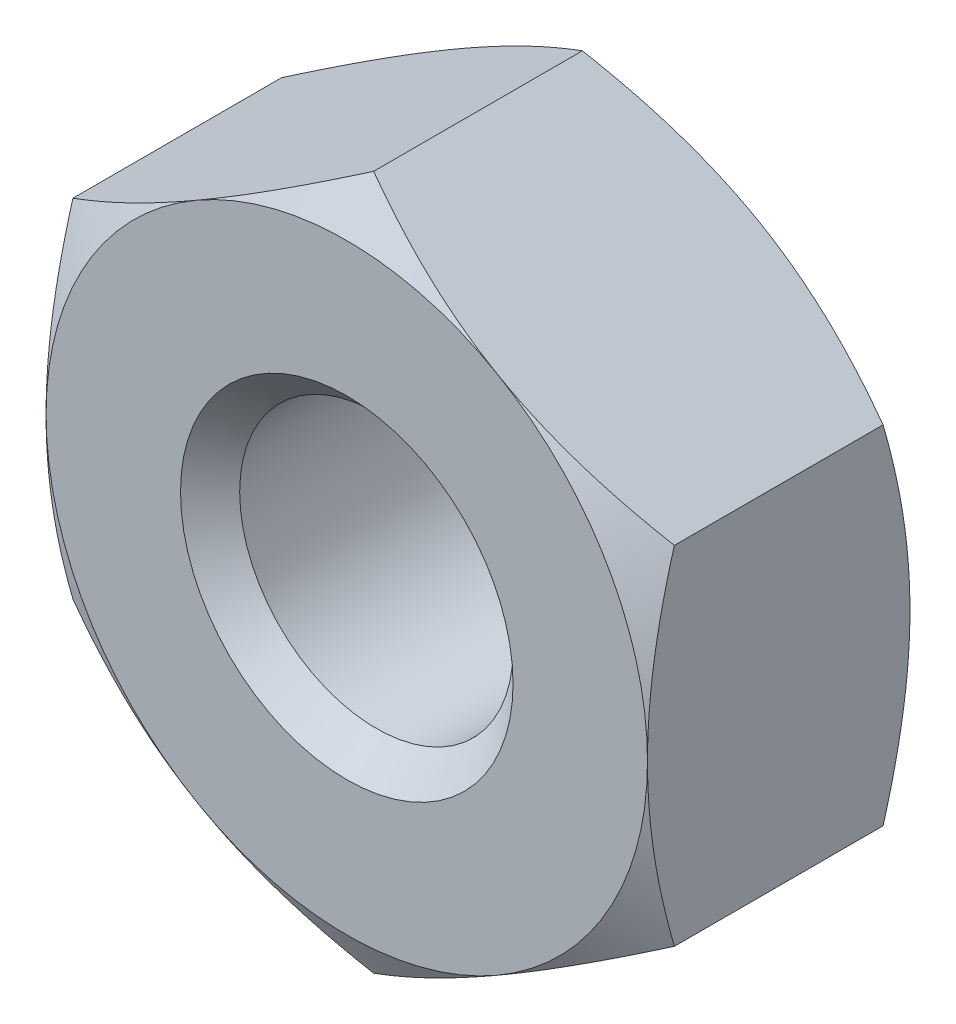
ISO-10303-21;
HEADER;
FILE_DESCRIPTION(('STEP AP214'),'2;1');
FILE_NAME('part.step','',(''),(''),'','','');
FILE_SCHEMA(('AUTOMOTIVE_DESIGN { 1 0 10303 214 1 1 1 1 }'));
ENDSEC;
DATA;
#1=APPLICATION_CONTEXT('core data for automotive mechanical design processes');
#2=APPLICATION_PROTOCOL_DEFINITION('international standard','automotive_design',2000,#1);
#3=PRODUCT_CONTEXT('',#1,'mechanical');
#4=PRODUCT('Part','Part','',(#3));
#5=PRODUCT_RELATED_PRODUCT_CATEGORY('part','',(#4));
#6=PRODUCT_DEFINITION_FORMATION('','',#4);
#7=PRODUCT_DEFINITION_CONTEXT('part definition',#1,'design');
#8=PRODUCT_DEFINITION('design','',#6,#7);
#9=PRODUCT_DEFINITION_SHAPE('','',#8);
#10=(LENGTH_UNIT() NAMED_UNIT(*) SI_UNIT(.MILLI.,.METRE.));
#11=(NAMED_UNIT(*) PLANE_ANGLE_UNIT() SI_UNIT($,.RADIAN.));
#12=(NAMED_UNIT(*) SI_UNIT($,.STERADIAN.) SOLID_ANGLE_UNIT());
#13=UNCERTAINTY_MEASURE_WITH_UNIT(LENGTH_MEASURE(1.E-05),#10,'distance_accuracy_value','');
#14=(GEOMETRIC_REPRESENTATION_CONTEXT(3) GLOBAL_UNCERTAINTY_ASSIGNED_CONTEXT((#13)) GLOBAL_UNIT_ASSIGNED_CONTEXT((#10,
#11,#12)) REPRESENTATION_CONTEXT('',''));
#15=CARTESIAN_POINT('',(0.,0.,0.));
#16=DIRECTION('',(0.,0.,1.));
#17=DIRECTION('',(1.,0.,0.));
#18=AXIS2_PLACEMENT_3D('',#15,#16,#17);
#19=CARTESIAN_POINT('',(0.,3.17542648054294,1.2));
#20=DIRECTION('',(0.5,-0.866025403784439,0.));
#21=DIRECTION('',(0.866025403784439,0.5,0.));
#22=AXIS2_PLACEMENT_3D('',#19,#20,#21);
#23=PLANE('',#22);
#24=CARTESIAN_POINT('',(0.000200000000000067,3.17554195059678,0.954313236635245));
#25=CARTESIAN_POINT('',(-0.120649220659906,3.10576962051743,0.994612337750741));
#26=CARTESIAN_POINT('',(-0.242541602622633,3.03539502097908,1.03126309740234));
#27=CARTESIAN_POINT('',(-0.488437126727892,2.89342717394439,1.0952378170302));
#28=CARTESIAN_POINT('',(-0.612444638573855,2.82183140359858,1.12253914432551));
#29=CARTESIAN_POINT('',(-0.858922797975943,2.67952717191842,1.16503825470589));
#30=CARTESIAN_POINT('',(-0.981355518587416,2.60884060771577,1.18051888137754));
#31=CARTESIAN_POINT('',(-1.22679714236891,2.46713482015519,1.19900060263006));
#32=CARTESIAN_POINT('',(-1.34980515323291,2.39611611197038,1.2020170005374));
#33=CARTESIAN_POINT('',(-1.57965878661079,2.26341005486544,1.19574685457145));
#34=CARTESIAN_POINT('',(-1.68653879125402,2.20170285541369,1.1879998457233));
#35=CARTESIAN_POINT('',(-1.89960246733475,2.07869048467395,1.16344481893565));
#36=CARTESIAN_POINT('',(-2.00578540164889,2.01738573896433,1.14662841034943));
#37=CARTESIAN_POINT('',(-2.21928848939318,1.89411967378235,1.10458807765405));
#38=CARTESIAN_POINT('',(-2.32658161614286,1.83217395817123,1.07918591931277));
#39=CARTESIAN_POINT('',(-2.53956747928405,1.70920651275308,1.02153277416002));
#40=CARTESIAN_POINT('',(-2.64526294502665,1.64818320715446,0.98929533670102));
#41=CARTESIAN_POINT('',(-2.7502,1.58759777021763,0.954313236635243));
#42=B_SPLINE_CURVE_WITH_KNOTS('',3,(#24,#25,#26,#27,#28,#29,#30,#31,#32,#33,#34,#35,#36,#37,#38,
#39,#40,#41),.UNSPECIFIED.,.F.,.F.,(4,2,2,2,2,2,2,2,4),(0.,0.435912828725888,0.872873557116331,
1.29901931904671,1.72464171213573,2.09526089052937,2.46622354066374,2.84541551798557,
3.22386274754524),.UNSPECIFIED.);
#43=CARTESIAN_POINT('',(0.,3.17542648054294,0.954379906938143));
#44=VERTEX_POINT('',#43);
#45=CARTESIAN_POINT('',(-1.375,2.38156986040721,1.2));
#46=VERTEX_POINT('',#45);
#47=EDGE_CURVE('E120',#44,#46,#42,.T.);
#48=ORIENTED_EDGE('',*,*,#47,.F.);
#49=DIRECTION('',(0.,0.,-1.));
#50=VECTOR('',#49,1.);
#51=CARTESIAN_POINT('',(0.,3.17542648054294,1.2));
#52=LINE('',#51,#50);
#53=CARTESIAN_POINT('',(0.,3.17542648054294,-0.954379906938143));
#54=VERTEX_POINT('',#53);
#55=EDGE_CURVE('E234',#44,#54,#52,.T.);
#56=ORIENTED_EDGE('',*,*,#55,.T.);
#57=CARTESIAN_POINT('',(-2.7502,1.58759777021763,-0.954313236635243));
#58=CARTESIAN_POINT('',(-2.6293507793401,1.65737010029699,-0.99461233775074));
#59=CARTESIAN_POINT('',(-2.50745839737737,1.72774469983533,-1.03126309740234));
#60=CARTESIAN_POINT('',(-2.26156287327211,1.86971254687003,-1.0952378170302));
#61=CARTESIAN_POINT('',(-2.13755536142615,1.94130831721583,-1.1225391443255));
#62=CARTESIAN_POINT('',(-1.89107720202406,2.08361254889599,-1.16503825470588));
#63=CARTESIAN_POINT('',(-1.76864448141259,2.15429911309864,-1.18051888137754));
#64=CARTESIAN_POINT('',(-1.52320285763109,2.29600490065923,-1.19900060263006));
#65=CARTESIAN_POINT('',(-1.40019484676709,2.36702360884404,-1.2020170005374));
#66=CARTESIAN_POINT('',(-1.17034121338921,2.49972966594897,-1.19574685457146));
#67=CARTESIAN_POINT('',(-1.06346120874598,2.56143686540072,-1.1879998457233));
#68=CARTESIAN_POINT('',(-0.850397532665252,2.68444923614046,-1.16344481893565));
#69=CARTESIAN_POINT('',(-0.744214598351113,2.74575398185008,-1.14662841034943));
#70=CARTESIAN_POINT('',(-0.530711510606817,2.86902004703206,-1.10458807765405));
#71=CARTESIAN_POINT('',(-0.423418383857146,2.93096576264318,-1.07918591931277));
#72=CARTESIAN_POINT('',(-0.210432520715949,3.05393320806134,-1.02153277416002));
#73=CARTESIAN_POINT('',(-0.104737054973348,3.11495651365995,-0.989295336701022));
#74=CARTESIAN_POINT('',(0.000199999999999903,3.17554195059678,-0.954313236635244));
#75=B_SPLINE_CURVE_WITH_KNOTS('',3,(#57,#58,#59,#60,#61,#62,#63,#64,#65,#66,#67,#68,#69,#70,#71,
#72,#73,#74),.UNSPECIFIED.,.F.,.F.,(4,2,2,2,2,2,2,2,4),(0.,0.435912828725888,0.872873557116332,
1.29901931904671,1.72464171213573,2.09526089052937,2.46622354066374,2.84541551798557,
3.22386274754524),.UNSPECIFIED.);
#76=CARTESIAN_POINT('',(-1.375,2.38156986040721,-1.2));
#77=VERTEX_POINT('',#76);
#78=EDGE_CURVE('E273',#77,#54,#75,.T.);
#79=ORIENTED_EDGE('',*,*,#78,.F.);
#80=CARTESIAN_POINT('',(-2.75,1.58771324027147,-0.954379906938141));
#81=VERTEX_POINT('',#80);
#82=EDGE_CURVE('E280',#81,#77,#75,.T.);
#83=ORIENTED_EDGE('',*,*,#82,.F.);
#84=DIRECTION('',(0.,0.,-1.));
#85=VECTOR('',#84,1.);
#86=CARTESIAN_POINT('',(-2.75,1.58771324027147,1.2));
#87=LINE('',#86,#85);
#88=CARTESIAN_POINT('',(-2.75,1.58771324027147,0.954379906938141));
#89=VERTEX_POINT('',#88);
#90=EDGE_CURVE('E148',#89,#81,#87,.T.);
#91=ORIENTED_EDGE('',*,*,#90,.F.);
#92=EDGE_CURVE('E130',#46,#89,#42,.T.);
#93=ORIENTED_EDGE('',*,*,#92,.F.);
#94=EDGE_LOOP('',(#48,#56,#79,#83,#91,#93));
#95=FACE_BOUND('',#94,.T.);
#96=ADVANCED_FACE('F32',(#95),#23,.F.);
#97=CARTESIAN_POINT('',(-2.75,1.58771324027147,1.2));
#98=DIRECTION('',(1.,0.,0.));
#99=DIRECTION('',(0.,0.,-1.));
#100=AXIS2_PLACEMENT_3D('',#97,#98,#99);
#101=PLANE('',#100);
#102=CARTESIAN_POINT('',(-2.75,-4.30390301720192,-0.161076408690709));
#103=CARTESIAN_POINT('',(-2.75,-4.18346183634496,-0.102495462412532));
#104=CARTESIAN_POINT('',(-2.75,-4.0627483469381,-0.0444649946513373));
#105=CARTESIAN_POINT('',(-2.75,-3.82063209362853,0.0701861633604315));
#106=CARTESIAN_POINT('',(-2.75,-3.69922922817248,0.126806638918857));
#107=CARTESIAN_POINT('',(-2.75,-3.45498258352431,0.238605553593725));
#108=CARTESIAN_POINT('',(-2.75,-3.33213458050091,0.293774796098297));
#109=CARTESIAN_POINT('',(-2.75,-3.08547511508691,0.401907353546585));
#110=CARTESIAN_POINT('',(-2.75,-2.9616636973982,0.454870770123538));
#111=CARTESIAN_POINT('',(-2.75,-2.70873002170802,0.559731360532049));
#112=CARTESIAN_POINT('',(-2.75,-2.57956837503753,0.611534033727881));
#113=CARTESIAN_POINT('',(-2.75,-2.31974843728962,0.711312632694245));
#114=CARTESIAN_POINT('',(-2.75,-2.18908998221528,0.759288134467373));
#115=CARTESIAN_POINT('',(-2.75,-1.92630078982448,0.850181497874872));
#116=CARTESIAN_POINT('',(-2.75,-1.79417351465773,0.893109270571312));
#117=CARTESIAN_POINT('',(-2.75,-1.52802381114163,0.972555534531259));
#118=CARTESIAN_POINT('',(-2.75,-1.39400198148718,1.00907600370378));
#119=CARTESIAN_POINT('',(-2.75,-1.1247426051988,1.07378343729295));
#120=CARTESIAN_POINT('',(-2.75,-0.98951651847669,1.10201722216622));
#121=CARTESIAN_POINT('',(-2.75,-0.717342133540144,1.14858513052455));
#122=CARTESIAN_POINT('',(-2.75,-0.580394010714915,1.16692025396294));
#123=CARTESIAN_POINT('',(-2.75,-0.307264223292112,1.19198982834036));
#124=CARTESIAN_POINT('',(-2.75,-0.171096876658298,1.19887642876326));
#125=CARTESIAN_POINT('',(-2.75,0.101336625313081,1.20086815686916));
#126=CARTESIAN_POINT('',(-2.75,0.237602781705956,1.19597315681277));
#127=CARTESIAN_POINT('',(-2.75,0.467797680560964,1.17810232782276));
#128=CARTESIAN_POINT('',(-2.75,0.561967915481139,1.1680452223586));
#129=CARTESIAN_POINT('',(-2.75,0.749642226834777,1.14290982744911));
#130=CARTESIAN_POINT('',(-2.75,0.843146215373774,1.12783088758256));
#131=CARTESIAN_POINT('',(-2.75,1.12250913895018,1.07584910895217));
#132=CARTESIAN_POINT('',(-2.75,1.30711940645803,1.03221009052051));
#133=CARTESIAN_POINT('',(-2.75,1.67667658210268,0.930598702582513));
#134=CARTESIAN_POINT('',(-2.75,1.86153763251216,0.87232596653366));
#135=CARTESIAN_POINT('',(-2.75,2.1362551669383,0.777677043706087));
#136=CARTESIAN_POINT('',(-2.75,2.2273905801987,0.74492404175435));
#137=CARTESIAN_POINT('',(-2.75,2.40890358977874,0.677382180856329));
#138=CARTESIAN_POINT('',(-2.75,2.49928119650105,0.642593349909013));
#139=CARTESIAN_POINT('',(-2.75,2.71825345258565,0.555929422896168));
#140=CARTESIAN_POINT('',(-2.75,2.84649489461499,0.503164300130228));
#141=CARTESIAN_POINT('',(-2.75,3.1018305499463,0.394920499569286));
#142=CARTESIAN_POINT('',(-2.75,3.22892468521528,0.33944163882475));
#143=CARTESIAN_POINT('',(-2.75,3.60884508520057,0.16980731720821));
#144=CARTESIAN_POINT('',(-2.75,3.86025161382976,0.0524776136911526));
#145=CARTESIAN_POINT('',(-2.75,4.36073216273561,-0.187701259786246));
#146=CARTESIAN_POINT('',(-2.75,4.60980322815241,-0.310556513491473));
#147=CARTESIAN_POINT('',(-2.75,5.10611636333848,-0.559922515280733));
#148=CARTESIAN_POINT('',(-2.75,5.35335836018192,-0.686433408140724));
#149=CARTESIAN_POINT('',(-2.75,5.82470677893949,-0.930706625425102));
#150=CARTESIAN_POINT('',(-2.75,6.04892545541808,-1.04825313857293));
#151=CARTESIAN_POINT('',(-2.75,6.49653363605935,-1.28493475206167));
#152=CARTESIAN_POINT('',(-2.75,6.71992310596418,-1.40406991712259));
#153=CARTESIAN_POINT('',(-2.75,7.1654482395454,-1.64321658337444));
#154=CARTESIAN_POINT('',(-2.75,7.38758566096615,-1.76322481484964));
#155=CARTESIAN_POINT('',(-2.75,7.83133346602344,-2.00418017005894));
#156=CARTESIAN_POINT('',(-2.75,8.05294388084433,-2.12512723633796));
#157=CARTESIAN_POINT('',(-2.75,8.27436218409939,-2.24642255294576));
#158=B_SPLINE_CURVE_WITH_KNOTS('',3,(#102,#103,#104,#105,#106,#107,#108,#109,#110,#111,#112,
#113,#114,#115,#116,#117,#118,#119,#120,#121,#122,#123,#124,#125,#126,#127,#128,#129,#130,#131,
#132,#133,#134,#135,#136,#137,#138,#139,#140,#141,#142,#143,#144,#145,#146,#147,#148,#149,#150,
#151,#152,#153,#154,#155,#156,#157),.UNSPECIFIED.,.F.,.F.,(4,2,2,2,2,2,2,2,2,2,2,2,2,2,2,2,2,2,
2,2,2,2,2,2,2,2,2,4),(0.,0.401800999438933,0.803662809496789,1.2076472715733,1.61161309946231,
2.02905420356356,2.44654149029695,2.86319485917833,3.27971938165075,3.69384308413964,
4.10792494441558,4.51645837884831,4.92499624273394,5.20897756068255,5.49299567382162,
6.06133052851013,6.64245100592872,6.93295892589162,7.22346285140748,7.63943779361214,
8.055440817965,8.88763374209439,9.72076650036463,10.5539322989188,11.31341213061,
12.0729229978166,12.8303656683841,13.5877623445881),.UNSPECIFIED.);
#159=CARTESIAN_POINT('',(-2.75,0.,1.2));
#160=VERTEX_POINT('',#159);
#161=EDGE_CURVE('E137',#89,#160,#158,.F.);
#162=ORIENTED_EDGE('',*,*,#161,.F.);
#163=ORIENTED_EDGE('',*,*,#90,.T.);
#164=CARTESIAN_POINT('',(-2.75,-4.30390301720192,0.161076408690709));
#165=CARTESIAN_POINT('',(-2.75,-4.18346183634496,0.102495462412532));
#166=CARTESIAN_POINT('',(-2.75,-4.0627483469381,0.0444649946513373));
#167=CARTESIAN_POINT('',(-2.75,-3.82063209362853,-0.0701861633604315));
#168=CARTESIAN_POINT('',(-2.75,-3.69922922817248,-0.126806638918857));
#169=CARTESIAN_POINT('',(-2.75,-3.45498258352431,-0.238605553593725));
#170=CARTESIAN_POINT('',(-2.75,-3.33213458050091,-0.293774796098297));
#171=CARTESIAN_POINT('',(-2.75,-3.08547511508691,-0.401907353546585));
#172=CARTESIAN_POINT('',(-2.75,-2.9616636973982,-0.454870770123538));
#173=CARTESIAN_POINT('',(-2.75,-2.70873002170802,-0.559731360532049));
#174=CARTESIAN_POINT('',(-2.75,-2.57956837503753,-0.611534033727881));
#175=CARTESIAN_POINT('',(-2.75,-2.31974843728962,-0.711312632694245));
#176=CARTESIAN_POINT('',(-2.75,-2.18908998221528,-0.759288134467373));
#177=CARTESIAN_POINT('',(-2.75,-1.92630078982448,-0.850181497874872));
#178=CARTESIAN_POINT('',(-2.75,-1.79417351465773,-0.893109270571312));
#179=CARTESIAN_POINT('',(-2.75,-1.52802381114163,-0.972555534531259));
#180=CARTESIAN_POINT('',(-2.75,-1.39400198148718,-1.00907600370378));
#181=CARTESIAN_POINT('',(-2.75,-1.1247426051988,-1.07378343729295));
#182=CARTESIAN_POINT('',(-2.75,-0.98951651847669,-1.10201722216622));
#183=CARTESIAN_POINT('',(-2.75,-0.717342133540144,-1.14858513052455));
#184=CARTESIAN_POINT('',(-2.75,-0.580394010714915,-1.16692025396294));
#185=CARTESIAN_POINT('',(-2.75,-0.307264223292112,-1.19198982834036));
#186=CARTESIAN_POINT('',(-2.75,-0.171096876658298,-1.19887642876326));
#187=CARTESIAN_POINT('',(-2.75,0.101336625313081,-1.20086815686916));
#188=CARTESIAN_POINT('',(-2.75,0.237602781705956,-1.19597315681277));
#189=CARTESIAN_POINT('',(-2.75,0.467797680560964,-1.17810232782276));
#190=CARTESIAN_POINT('',(-2.75,0.561967915481139,-1.1680452223586));
#191=CARTESIAN_POINT('',(-2.75,0.749642226834777,-1.14290982744911));
#192=CARTESIAN_POINT('',(-2.75,0.843146215373774,-1.12783088758256));
#193=CARTESIAN_POINT('',(-2.75,1.12250913895018,-1.07584910895217));
#194=CARTESIAN_POINT('',(-2.75,1.30711940645803,-1.03221009052051));
#195=CARTESIAN_POINT('',(-2.75,1.67667658210268,-0.930598702582513));
#196=CARTESIAN_POINT('',(-2.75,1.86153763251216,-0.87232596653366));
#197=CARTESIAN_POINT('',(-2.75,2.1362551669383,-0.777677043706087));
#198=CARTESIAN_POINT('',(-2.75,2.2273905801987,-0.74492404175435));
#199=CARTESIAN_POINT('',(-2.75,2.40890358977874,-0.677382180856329));
#200=CARTESIAN_POINT('',(-2.75,2.49928119650105,-0.642593349909013));
#201=CARTESIAN_POINT('',(-2.75,2.71825345258565,-0.555929422896168));
#202=CARTESIAN_POINT('',(-2.75,2.84649489461499,-0.503164300130228));
#203=CARTESIAN_POINT('',(-2.75,3.1018305499463,-0.394920499569286));
#204=CARTESIAN_POINT('',(-2.75,3.22892468521528,-0.33944163882475));
#205=CARTESIAN_POINT('',(-2.75,3.60884508520057,-0.16980731720821));
#206=CARTESIAN_POINT('',(-2.75,3.86025161382976,-0.0524776136911526));
#207=CARTESIAN_POINT('',(-2.75,4.36073216273561,0.187701259786246));
#208=CARTESIAN_POINT('',(-2.75,4.60980322815241,0.310556513491473));
#209=CARTESIAN_POINT('',(-2.75,5.10611636333848,0.559922515280733));
#210=CARTESIAN_POINT('',(-2.75,5.35335836018192,0.686433408140724));
#211=CARTESIAN_POINT('',(-2.75,5.82470677893949,0.930706625425102));
#212=CARTESIAN_POINT('',(-2.75,6.04892545541808,1.04825313857293));
#213=CARTESIAN_POINT('',(-2.75,6.49653363605935,1.28493475206167));
#214=CARTESIAN_POINT('',(-2.75,6.71992310596418,1.40406991712259));
#215=CARTESIAN_POINT('',(-2.75,7.1654482395454,1.64321658337444));
#216=CARTESIAN_POINT('',(-2.75,7.38758566096615,1.76322481484964));
#217=CARTESIAN_POINT('',(-2.75,7.83133346602344,2.00418017005894));
#218=CARTESIAN_POINT('',(-2.75,8.05294388084433,2.12512723633796));
#219=CARTESIAN_POINT('',(-2.75,8.27436218409939,2.24642255294576));
#220=B_SPLINE_CURVE_WITH_KNOTS('',3,(#164,#165,#166,#167,#168,#169,#170,#171,#172,#173,#174,
#175,#176,#177,#178,#179,#180,#181,#182,#183,#184,#185,#186,#187,#188,#189,#190,#191,#192,#193,
#194,#195,#196,#197,#198,#199,#200,#201,#202,#203,#204,#205,#206,#207,#208,#209,#210,#211,#212,
#213,#214,#215,#216,#217,#218,#219),.UNSPECIFIED.,.F.,.F.,(4,2,2,2,2,2,2,2,2,2,2,2,2,2,2,2,2,2,
2,2,2,2,2,2,2,2,2,4),(0.,0.401800999438933,0.803662809496789,1.2076472715733,1.61161309946231,
2.02905420356356,2.44654149029695,2.86319485917833,3.27971938165075,3.69384308413964,
4.10792494441558,4.51645837884831,4.92499624273394,5.20897756068255,5.49299567382162,
6.06133052851013,6.64245100592872,6.93295892589162,7.22346285140748,7.63943779361214,
8.055440817965,8.88763374209439,9.72076650036463,10.5539322989188,11.31341213061,
12.0729229978166,12.8303656683841,13.5877623445881),.UNSPECIFIED.);
#221=CARTESIAN_POINT('',(-2.75,0.,-1.2));
#222=VERTEX_POINT('',#221);
#223=EDGE_CURVE('E228',#222,#81,#220,.T.);
#224=ORIENTED_EDGE('',*,*,#223,.F.);
#225=CARTESIAN_POINT('',(-2.75,-1.58771324027169,-0.954379906938282));
#226=VERTEX_POINT('',#225);
#227=EDGE_CURVE('E292',#226,#222,#220,.T.);
#228=ORIENTED_EDGE('',*,*,#227,.F.);
#229=DIRECTION('',(0.,0.,-1.));
#230=VECTOR('',#229,1.);
#231=CARTESIAN_POINT('',(-2.75,-1.58771324027147,1.2));
#232=LINE('',#231,#230);
#233=CARTESIAN_POINT('',(-2.75,-1.58771324027147,0.95437990693814));
#234=VERTEX_POINT('',#233);
#235=EDGE_CURVE('E242',#234,#226,#232,.T.);
#236=ORIENTED_EDGE('',*,*,#235,.F.);
#237=EDGE_CURVE('E149',#160,#234,#158,.F.);
#238=ORIENTED_EDGE('',*,*,#237,.F.);
#239=EDGE_LOOP('',(#162,#163,#224,#228,#236,#238));
#240=FACE_BOUND('',#239,.T.);
#241=ADVANCED_FACE('F212',(#240),#101,.F.);
#242=CARTESIAN_POINT('',(-2.75,-1.58771324027147,1.2));
#243=DIRECTION('',(0.5,0.866025403784438,0.));
#244=DIRECTION('',(-0.866025403784439,0.5,0.));
#245=AXIS2_PLACEMENT_3D('',#242,#243,#244);
#246=PLANE('',#245);
#247=CARTESIAN_POINT('',(-2.7502,-1.58759777021764,0.954313236635242));
#248=CARTESIAN_POINT('',(-2.6293507793401,-1.65737010029699,0.994612337750739));
#249=CARTESIAN_POINT('',(-2.50745839737737,-1.72774469983533,1.03126309740234));
#250=CARTESIAN_POINT('',(-2.26156287327211,-1.86971254687003,1.0952378170302));
#251=CARTESIAN_POINT('',(-2.13755536142615,-1.94130831721583,1.1225391443255));
#252=CARTESIAN_POINT('',(-1.89107720202406,-2.08361254889599,1.16503825470588));
#253=CARTESIAN_POINT('',(-1.76864448141259,-2.15429911309864,1.18051888137754));
#254=CARTESIAN_POINT('',(-1.52320285763109,-2.29600490065923,1.19900060263006));
#255=CARTESIAN_POINT('',(-1.40019484676709,-2.36702360884404,1.2020170005374));
#256=CARTESIAN_POINT('',(-1.17034121338921,-2.49972966594897,1.19574685457145));
#257=CARTESIAN_POINT('',(-1.06346120874598,-2.56143686540073,1.1879998457233));
#258=CARTESIAN_POINT('',(-0.850397532665252,-2.68444923614047,1.16344481893564));
#259=CARTESIAN_POINT('',(-0.744214598351113,-2.74575398185008,1.14662841034943));
#260=CARTESIAN_POINT('',(-0.530711510606818,-2.86902004703207,1.10458807765404));
#261=CARTESIAN_POINT('',(-0.423418383857146,-2.93096576264319,1.07918591931277));
#262=CARTESIAN_POINT('',(-0.21043252071595,-3.05393320806134,1.02153277416002));
#263=CARTESIAN_POINT('',(-0.104737054973348,-3.11495651365996,0.989295336701018));
#264=CARTESIAN_POINT('',(0.000199999999999743,-3.17554195059679,0.954313236635241));
#265=B_SPLINE_CURVE_WITH_KNOTS('',3,(#247,#248,#249,#250,#251,#252,#253,#254,#255,#256,#257,
#258,#259,#260,#261,#262,#263,#264),.UNSPECIFIED.,.F.,.F.,(4,2,2,2,2,2,2,2,4),(0.,
0.435912828725888,0.872873557116332,1.29901931904672,1.72464171213574,2.09526089052938,
2.46622354066374,2.84541551798557,3.22386274754525),.UNSPECIFIED.);
#266=CARTESIAN_POINT('',(-1.375,-2.38156986040721,1.2));
#267=VERTEX_POINT('',#266);
#268=EDGE_CURVE('E206',#234,#267,#265,.T.);
#269=ORIENTED_EDGE('',*,*,#268,.F.);
#270=ORIENTED_EDGE('',*,*,#235,.T.);
#271=CARTESIAN_POINT('',(0.000199999999999867,-3.17554195059679,-0.954313236635241));
#272=CARTESIAN_POINT('',(-0.120649220659906,-3.10576962051743,-0.994612337750738));
#273=CARTESIAN_POINT('',(-0.242541602622634,-3.03539502097909,-1.03126309740234));
#274=CARTESIAN_POINT('',(-0.488437126727893,-2.89342717394439,-1.0952378170302));
#275=CARTESIAN_POINT('',(-0.612444638573856,-2.82183140359859,-1.1225391443255));
#276=CARTESIAN_POINT('',(-0.858922797975945,-2.67952717191843,-1.16503825470588));
#277=CARTESIAN_POINT('',(-0.981355518587418,-2.60884060771578,-1.18051888137754));
#278=CARTESIAN_POINT('',(-1.22679714236892,-2.46713482015519,-1.19900060263006));
#279=CARTESIAN_POINT('',(-1.34980515323291,-2.39611611197038,-1.2020170005374));
#280=CARTESIAN_POINT('',(-1.57965878661079,-2.26341005486545,-1.19574685457145));
#281=CARTESIAN_POINT('',(-1.68653879125402,-2.20170285541369,-1.1879998457233));
#282=CARTESIAN_POINT('',(-1.89960246733475,-2.07869048467395,-1.16344481893564));
#283=CARTESIAN_POINT('',(-2.00578540164889,-2.01738573896434,-1.14662841034943));
#284=CARTESIAN_POINT('',(-2.21928848939319,-1.89411967378235,-1.10458807765404));
#285=CARTESIAN_POINT('',(-2.32658161614286,-1.83217395817123,-1.07918591931277));
#286=CARTESIAN_POINT('',(-2.53956747928405,-1.70920651275308,-1.02153277416002));
#287=CARTESIAN_POINT('',(-2.64526294502665,-1.64818320715446,-0.989295336701019));
#288=CARTESIAN_POINT('',(-2.7502,-1.58759777021764,-0.954313236635242));
#289=B_SPLINE_CURVE_WITH_KNOTS('',3,(#271,#272,#273,#274,#275,#276,#277,#278,#279,#280,#281,
#282,#283,#284,#285,#286,#287,#288),.UNSPECIFIED.,.F.,.F.,(4,2,2,2,2,2,2,2,4),(0.,
0.435912828725888,0.872873557116332,1.29901931904672,1.72464171213574,2.09526089052938,
2.46622354066374,2.84541551798557,3.22386274754525),.UNSPECIFIED.);
#290=CARTESIAN_POINT('',(-1.375,-2.38156986040721,-1.2));
#291=VERTEX_POINT('',#290);
#292=EDGE_CURVE('E218',#291,#226,#289,.T.);
#293=ORIENTED_EDGE('',*,*,#292,.F.);
#294=CARTESIAN_POINT('',(0.,-3.17542648054295,-0.954379906938139));
#295=VERTEX_POINT('',#294);
#296=EDGE_CURVE('E226',#295,#291,#289,.T.);
#297=ORIENTED_EDGE('',*,*,#296,.F.);
#298=DIRECTION('',(0.,0.,-1.));
#299=VECTOR('',#298,1.);
#300=CARTESIAN_POINT('',(0.,-3.17542648054295,1.2));
#301=LINE('',#300,#299);
#302=CARTESIAN_POINT('',(0.,-3.17542648054295,0.954379906938139));
#303=VERTEX_POINT('',#302);
#304=EDGE_CURVE('E240',#303,#295,#301,.T.);
#305=ORIENTED_EDGE('',*,*,#304,.F.);
#306=EDGE_CURVE('E200',#267,#303,#265,.T.);
#307=ORIENTED_EDGE('',*,*,#306,.F.);
#308=EDGE_LOOP('',(#269,#270,#293,#297,#305,#307));
#309=FACE_BOUND('',#308,.T.);
#310=ADVANCED_FACE('F208',(#309),#246,.F.);
#311=CARTESIAN_POINT('',(0.,-3.17542648054295,1.2));
#312=DIRECTION('',(-0.500000000000001,0.866025403784438,0.));
#313=DIRECTION('',(-0.866025403784438,-0.500000000000001,0.));
#314=AXIS2_PLACEMENT_3D('',#311,#312,#313);
#315=PLANE('',#314);
#316=CARTESIAN_POINT('',(-0.000200000000000038,-3.17554195059679,0.954313236635241));
#317=CARTESIAN_POINT('',(0.120649220659906,-3.10576962051743,0.994612337750738));
#318=CARTESIAN_POINT('',(0.242541602622634,-3.03539502097909,1.03126309740234));
#319=CARTESIAN_POINT('',(0.488437126727893,-2.89342717394439,1.0952378170302));
#320=CARTESIAN_POINT('',(0.612444638573855,-2.82183140359859,1.1225391443255));
#321=CARTESIAN_POINT('',(0.858922797975944,-2.67952717191843,1.16503825470588));
#322=CARTESIAN_POINT('',(0.981355518587417,-2.60884060771578,1.18051888137754));
#323=CARTESIAN_POINT('',(1.22679714236892,-2.46713482015519,1.19900060263006));
#324=CARTESIAN_POINT('',(1.34980515323291,-2.39611611197038,1.2020170005374));
#325=CARTESIAN_POINT('',(1.57965878661079,-2.26341005486545,1.19574685457145));
#326=CARTESIAN_POINT('',(1.68653879125402,-2.20170285541369,1.1879998457233));
#327=CARTESIAN_POINT('',(1.89960246733475,-2.07869048467395,1.16344481893565));
#328=CARTESIAN_POINT('',(2.00578540164889,-2.01738573896434,1.14662841034943));
#329=CARTESIAN_POINT('',(2.21928848939318,-1.89411967378235,1.10458807765405));
#330=CARTESIAN_POINT('',(2.32658161614285,-1.83217395817123,1.07918591931277));
#331=CARTESIAN_POINT('',(2.53956747928405,-1.70920651275308,1.02153277416002));
#332=CARTESIAN_POINT('',(2.64526294502665,-1.64818320715447,0.989295336701021));
#333=CARTESIAN_POINT('',(2.7502,-1.58759777021764,0.954313236635244));
#334=B_SPLINE_CURVE_WITH_KNOTS('',3,(#316,#317,#318,#319,#320,#321,#322,#323,#324,#325,#326,
#327,#328,#329,#330,#331,#332,#333),.UNSPECIFIED.,.F.,.F.,(4,2,2,2,2,2,2,2,4),(0.,
0.435912828725888,0.872873557116332,1.29901931904672,1.72464171213574,2.09526089052938,
2.46622354066374,2.84541551798557,3.22386274754524),.UNSPECIFIED.);
#335=CARTESIAN_POINT('',(1.375,-2.38156986040721,1.2));
#336=VERTEX_POINT('',#335);
#337=EDGE_CURVE('E207',#303,#336,#334,.T.);
#338=ORIENTED_EDGE('',*,*,#337,.F.);
#339=ORIENTED_EDGE('',*,*,#304,.T.);
#340=CARTESIAN_POINT('',(2.7502,-1.58759777021764,-0.954313236635244));
#341=CARTESIAN_POINT('',(2.62935077934009,-1.65737010029699,-0.994612337750741));
#342=CARTESIAN_POINT('',(2.50745839737737,-1.72774469983533,-1.03126309740234));
#343=CARTESIAN_POINT('',(2.26156287327211,-1.86971254687003,-1.0952378170302));
#344=CARTESIAN_POINT('',(2.13755536142614,-1.94130831721583,-1.1225391443255));
#345=CARTESIAN_POINT('',(1.89107720202406,-2.08361254889599,-1.16503825470588));
#346=CARTESIAN_POINT('',(1.76864448141258,-2.15429911309864,-1.18051888137754));
#347=CARTESIAN_POINT('',(1.52320285763108,-2.29600490065923,-1.19900060263006));
#348=CARTESIAN_POINT('',(1.40019484676709,-2.36702360884404,-1.2020170005374));
#349=CARTESIAN_POINT('',(1.17034121338921,-2.49972966594897,-1.19574685457145));
#350=CARTESIAN_POINT('',(1.06346120874598,-2.56143686540073,-1.1879998457233));
#351=CARTESIAN_POINT('',(0.85039753266525,-2.68444923614047,-1.16344481893564));
#352=CARTESIAN_POINT('',(0.744214598351111,-2.74575398185008,-1.14662841034943));
#353=CARTESIAN_POINT('',(0.530711510606816,-2.86902004703207,-1.10458807765404));
#354=CARTESIAN_POINT('',(0.423418383857145,-2.93096576264319,-1.07918591931277));
#355=CARTESIAN_POINT('',(0.210432520715949,-3.05393320806134,-1.02153277416002));
#356=CARTESIAN_POINT('',(0.104737054973347,-3.11495651365996,-0.989295336701018));
#357=CARTESIAN_POINT('',(-0.000200000000000245,-3.17554195059679,-0.95431323663524));
#358=B_SPLINE_CURVE_WITH_KNOTS('',3,(#340,#341,#342,#343,#344,#345,#346,#347,#348,#349,#350,
#351,#352,#353,#354,#355,#356,#357),.UNSPECIFIED.,.F.,.F.,(4,2,2,2,2,2,2,2,4),(0.,
0.435912828725888,0.872873557116331,1.29901931904671,1.72464171213573,2.09526089052937,
2.46622354066374,2.84541551798557,3.22386274754524),.UNSPECIFIED.);
#359=CARTESIAN_POINT('',(1.375,-2.38156986040721,-1.2));
#360=VERTEX_POINT('',#359);
#361=EDGE_CURVE('E227',#360,#295,#358,.T.);
#362=ORIENTED_EDGE('',*,*,#361,.F.);
#363=CARTESIAN_POINT('',(2.75,-1.58771324027169,-0.954379906938284));
#364=VERTEX_POINT('',#363);
#365=EDGE_CURVE('E281',#364,#360,#358,.T.);
#366=ORIENTED_EDGE('',*,*,#365,.F.);
#367=DIRECTION('',(0.,0.,-1.));
#368=VECTOR('',#367,1.);
#369=CARTESIAN_POINT('',(2.75,-1.58771324027147,1.2));
#370=LINE('',#369,#368);
#371=CARTESIAN_POINT('',(2.75,-1.58771324027169,0.954379906938284));
#372=VERTEX_POINT('',#371);
#373=EDGE_CURVE('E238',#372,#364,#370,.T.);
#374=ORIENTED_EDGE('',*,*,#373,.F.);
#375=EDGE_CURVE('E194',#336,#372,#334,.T.);
#376=ORIENTED_EDGE('',*,*,#375,.F.);
#377=EDGE_LOOP('',(#338,#339,#362,#366,#374,#376));
#378=FACE_BOUND('',#377,.T.);
#379=ADVANCED_FACE('F211',(#378),#315,.F.);
#380=CARTESIAN_POINT('',(2.75,1.58771324027147,1.2));
#381=DIRECTION('',(-1.,0.,0.));
#382=DIRECTION('',(0.,0.,1.));
#383=AXIS2_PLACEMENT_3D('',#380,#381,#382);
#384=PLANE('',#383);
#385=CARTESIAN_POINT('',(2.75,-4.30390301720192,-0.161076408690707));
#386=CARTESIAN_POINT('',(2.75,-4.18346183634496,-0.10249546241253));
#387=CARTESIAN_POINT('',(2.75,-4.0627483469381,-0.0444649946513354));
#388=CARTESIAN_POINT('',(2.75,-3.82063209362853,0.0701861633604329));
#389=CARTESIAN_POINT('',(2.75,-3.69922922817248,0.126806638918858));
#390=CARTESIAN_POINT('',(2.75,-3.45498258352431,0.238605553593726));
#391=CARTESIAN_POINT('',(2.75,-3.33213458050091,0.293774796098298));
#392=CARTESIAN_POINT('',(2.75,-3.08547511508691,0.401907353546586));
#393=CARTESIAN_POINT('',(2.75,-2.9616636973982,0.454870770123539));
#394=CARTESIAN_POINT('',(2.75,-2.70873002170802,0.559731360532051));
#395=CARTESIAN_POINT('',(2.75,-2.57956837503753,0.611534033727882));
#396=CARTESIAN_POINT('',(2.75,-2.31974843728962,0.711312632694246));
#397=CARTESIAN_POINT('',(2.75,-2.18908998221529,0.759288134467374));
#398=CARTESIAN_POINT('',(2.75,-1.92630078982448,0.850181497874874));
#399=CARTESIAN_POINT('',(2.75,-1.79417351465773,0.893109270571313));
#400=CARTESIAN_POINT('',(2.75,-1.52802381114164,0.97255553453126));
#401=CARTESIAN_POINT('',(2.75,-1.39400198148719,1.00907600370379));
#402=CARTESIAN_POINT('',(2.75,-1.1247426051988,1.07378343729295));
#403=CARTESIAN_POINT('',(2.75,-0.989516518476692,1.10201722216623));
#404=CARTESIAN_POINT('',(2.75,-0.717342133540146,1.14858513052455));
#405=CARTESIAN_POINT('',(2.75,-0.580394010714917,1.16692025396294));
#406=CARTESIAN_POINT('',(2.75,-0.307264223292114,1.19198982834036));
#407=CARTESIAN_POINT('',(2.75,-0.1710968766583,1.19887642876326));
#408=CARTESIAN_POINT('',(2.75,0.10133662531308,1.20086815686916));
#409=CARTESIAN_POINT('',(2.75,0.237602781705954,1.19597315681277));
#410=CARTESIAN_POINT('',(2.75,0.467797680560962,1.17810232782276));
#411=CARTESIAN_POINT('',(2.75,0.561967915481136,1.1680452223586));
#412=CARTESIAN_POINT('',(2.75,0.749642226834775,1.14290982744911));
#413=CARTESIAN_POINT('',(2.75,0.843146215373771,1.12783088758256));
#414=CARTESIAN_POINT('',(2.75,1.12250913895018,1.07584910895217));
#415=CARTESIAN_POINT('',(2.75,1.30711940645803,1.03221009052051));
#416=CARTESIAN_POINT('',(2.75,1.67667658210268,0.930598702582516));
#417=CARTESIAN_POINT('',(2.75,1.86153763251216,0.872325966533663));
#418=CARTESIAN_POINT('',(2.75,2.1362551669383,0.77767704370609));
#419=CARTESIAN_POINT('',(2.75,2.22739058019869,0.744924041754353));
#420=CARTESIAN_POINT('',(2.75,2.40890358977874,0.677382180856333));
#421=CARTESIAN_POINT('',(2.75,2.49928119650104,0.642593349909017));
#422=CARTESIAN_POINT('',(2.75,2.71825345258564,0.555929422896172));
#423=CARTESIAN_POINT('',(2.75,2.84649489461498,0.503164300130232));
#424=CARTESIAN_POINT('',(2.75,3.10183054994629,0.39492049956929));
#425=CARTESIAN_POINT('',(2.75,3.22892468521527,0.339441638824753));
#426=CARTESIAN_POINT('',(2.75,3.60884508520057,0.169807317208212));
#427=CARTESIAN_POINT('',(2.75,3.86025161382976,0.0524776136911548));
#428=CARTESIAN_POINT('',(2.75,4.36073216273561,-0.187701259786244));
#429=CARTESIAN_POINT('',(2.75,4.60980322815241,-0.310556513491472));
#430=CARTESIAN_POINT('',(2.75,5.10611636333848,-0.559922515280732));
#431=CARTESIAN_POINT('',(2.75,5.35335836018192,-0.686433408140723));
#432=CARTESIAN_POINT('',(2.75,5.82470677893949,-0.930706625425101));
#433=CARTESIAN_POINT('',(2.75,6.04892545541808,-1.04825313857293));
#434=CARTESIAN_POINT('',(2.75,6.49653363605935,-1.28493475206167));
#435=CARTESIAN_POINT('',(2.75,6.71992310596418,-1.40406991712259));
#436=CARTESIAN_POINT('',(2.75,7.1654482395454,-1.64321658337444));
#437=CARTESIAN_POINT('',(2.75,7.38758566096615,-1.76322481484964));
#438=CARTESIAN_POINT('',(2.75,7.83133346602344,-2.00418017005893));
#439=CARTESIAN_POINT('',(2.75,8.05294388084433,-2.12512723633795));
#440=CARTESIAN_POINT('',(2.75,8.27436218409938,-2.24642255294575));
#441=B_SPLINE_CURVE_WITH_KNOTS('',3,(#385,#386,#387,#388,#389,#390,#391,#392,#393,#394,#395,
#396,#397,#398,#399,#400,#401,#402,#403,#404,#405,#406,#407,#408,#409,#410,#411,#412,#413,#414,
#415,#416,#417,#418,#419,#420,#421,#422,#423,#424,#425,#426,#427,#428,#429,#430,#431,#432,#433,
#434,#435,#436,#437,#438,#439,#440),.UNSPECIFIED.,.F.,.F.,(4,2,2,2,2,2,2,2,2,2,2,2,2,2,2,2,2,2,
2,2,2,2,2,2,2,2,2,4),(0.,0.401800999438931,0.803662809496787,1.20764727157329,1.61161309946231,
2.02905420356356,2.44654149029695,2.86319485917833,3.27971938165075,3.69384308413964,
4.10792494441558,4.51645837884831,4.92499624273394,5.20897756068255,5.49299567382162,
6.06133052851012,6.64245100592871,6.93295892589161,7.22346285140747,7.63943779361214,
8.05544081796499,8.88763374209439,9.72076650036463,10.5539322989188,11.31341213061,
12.0729229978166,12.8303656683841,13.5877623445881),.UNSPECIFIED.);
#442=CARTESIAN_POINT('',(2.75,0.,1.2));
#443=VERTEX_POINT('',#442);
#444=EDGE_CURVE('E342',#372,#443,#441,.T.);
#445=ORIENTED_EDGE('',*,*,#444,.F.);
#446=ORIENTED_EDGE('',*,*,#373,.T.);
#447=CARTESIAN_POINT('',(2.75,-4.30390301720192,0.161076408690707));
#448=CARTESIAN_POINT('',(2.75,-4.18346183634496,0.10249546241253));
#449=CARTESIAN_POINT('',(2.75,-4.0627483469381,0.0444649946513354));
#450=CARTESIAN_POINT('',(2.75,-3.82063209362853,-0.0701861633604329));
#451=CARTESIAN_POINT('',(2.75,-3.69922922817248,-0.126806638918858));
#452=CARTESIAN_POINT('',(2.75,-3.45498258352431,-0.238605553593726));
#453=CARTESIAN_POINT('',(2.75,-3.33213458050091,-0.293774796098298));
#454=CARTESIAN_POINT('',(2.75,-3.08547511508691,-0.401907353546586));
#455=CARTESIAN_POINT('',(2.75,-2.9616636973982,-0.454870770123539));
#456=CARTESIAN_POINT('',(2.75,-2.70873002170802,-0.559731360532051));
#457=CARTESIAN_POINT('',(2.75,-2.57956837503753,-0.611534033727882));
#458=CARTESIAN_POINT('',(2.75,-2.31974843728962,-0.711312632694246));
#459=CARTESIAN_POINT('',(2.75,-2.18908998221529,-0.759288134467374));
#460=CARTESIAN_POINT('',(2.75,-1.92630078982448,-0.850181497874874));
#461=CARTESIAN_POINT('',(2.75,-1.79417351465773,-0.893109270571313));
#462=CARTESIAN_POINT('',(2.75,-1.52802381114164,-0.97255553453126));
#463=CARTESIAN_POINT('',(2.75,-1.39400198148719,-1.00907600370379));
#464=CARTESIAN_POINT('',(2.75,-1.1247426051988,-1.07378343729295));
#465=CARTESIAN_POINT('',(2.75,-0.989516518476692,-1.10201722216623));
#466=CARTESIAN_POINT('',(2.75,-0.717342133540146,-1.14858513052455));
#467=CARTESIAN_POINT('',(2.75,-0.580394010714917,-1.16692025396294));
#468=CARTESIAN_POINT('',(2.75,-0.307264223292114,-1.19198982834036));
#469=CARTESIAN_POINT('',(2.75,-0.1710968766583,-1.19887642876326));
#470=CARTESIAN_POINT('',(2.75,0.10133662531308,-1.20086815686916));
#471=CARTESIAN_POINT('',(2.75,0.237602781705954,-1.19597315681277));
#472=CARTESIAN_POINT('',(2.75,0.467797680560962,-1.17810232782276));
#473=CARTESIAN_POINT('',(2.75,0.561967915481136,-1.1680452223586));
#474=CARTESIAN_POINT('',(2.75,0.749642226834775,-1.14290982744911));
#475=CARTESIAN_POINT('',(2.75,0.843146215373771,-1.12783088758256));
#476=CARTESIAN_POINT('',(2.75,1.12250913895018,-1.07584910895217));
#477=CARTESIAN_POINT('',(2.75,1.30711940645803,-1.03221009052051));
#478=CARTESIAN_POINT('',(2.75,1.67667658210268,-0.930598702582516));
#479=CARTESIAN_POINT('',(2.75,1.86153763251216,-0.872325966533663));
#480=CARTESIAN_POINT('',(2.75,2.1362551669383,-0.77767704370609));
#481=CARTESIAN_POINT('',(2.75,2.22739058019869,-0.744924041754353));
#482=CARTESIAN_POINT('',(2.75,2.40890358977874,-0.677382180856333));
#483=CARTESIAN_POINT('',(2.75,2.49928119650104,-0.642593349909017));
#484=CARTESIAN_POINT('',(2.75,2.71825345258564,-0.555929422896172));
#485=CARTESIAN_POINT('',(2.75,2.84649489461498,-0.503164300130232));
#486=CARTESIAN_POINT('',(2.75,3.10183054994629,-0.39492049956929));
#487=CARTESIAN_POINT('',(2.75,3.22892468521527,-0.339441638824753));
#488=CARTESIAN_POINT('',(2.75,3.60884508520057,-0.169807317208212));
#489=CARTESIAN_POINT('',(2.75,3.86025161382976,-0.0524776136911548));
#490=CARTESIAN_POINT('',(2.75,4.36073216273561,0.187701259786244));
#491=CARTESIAN_POINT('',(2.75,4.60980322815241,0.310556513491472));
#492=CARTESIAN_POINT('',(2.75,5.10611636333848,0.559922515280732));
#493=CARTESIAN_POINT('',(2.75,5.35335836018192,0.686433408140723));
#494=CARTESIAN_POINT('',(2.75,5.82470677893949,0.930706625425101));
#495=CARTESIAN_POINT('',(2.75,6.04892545541808,1.04825313857293));
#496=CARTESIAN_POINT('',(2.75,6.49653363605935,1.28493475206167));
#497=CARTESIAN_POINT('',(2.75,6.71992310596418,1.40406991712259));
#498=CARTESIAN_POINT('',(2.75,7.1654482395454,1.64321658337444));
#499=CARTESIAN_POINT('',(2.75,7.38758566096615,1.76322481484964));
#500=CARTESIAN_POINT('',(2.75,7.83133346602344,2.00418017005893));
#501=CARTESIAN_POINT('',(2.75,8.05294388084433,2.12512723633795));
#502=CARTESIAN_POINT('',(2.75,8.27436218409938,2.24642255294575));
#503=B_SPLINE_CURVE_WITH_KNOTS('',3,(#447,#448,#449,#450,#451,#452,#453,#454,#455,#456,#457,
#458,#459,#460,#461,#462,#463,#464,#465,#466,#467,#468,#469,#470,#471,#472,#473,#474,#475,#476,
#477,#478,#479,#480,#481,#482,#483,#484,#485,#486,#487,#488,#489,#490,#491,#492,#493,#494,#495,
#496,#497,#498,#499,#500,#501,#502),.UNSPECIFIED.,.F.,.F.,(4,2,2,2,2,2,2,2,2,2,2,2,2,2,2,2,2,2,
2,2,2,2,2,2,2,2,2,4),(0.,0.401800999438931,0.803662809496787,1.20764727157329,1.61161309946231,
2.02905420356356,2.44654149029695,2.86319485917833,3.27971938165075,3.69384308413964,
4.10792494441558,4.51645837884831,4.92499624273394,5.20897756068255,5.49299567382162,
6.06133052851012,6.64245100592871,6.93295892589161,7.22346285140747,7.63943779361214,
8.05544081796499,8.88763374209439,9.72076650036463,10.5539322989188,11.31341213061,
12.0729229978166,12.8303656683841,13.5877623445881),.UNSPECIFIED.);
#504=CARTESIAN_POINT('',(2.75,0.,-1.2));
#505=VERTEX_POINT('',#504);
#506=EDGE_CURVE('E274',#505,#364,#503,.F.);
#507=ORIENTED_EDGE('',*,*,#506,.F.);
#508=CARTESIAN_POINT('',(2.75,1.58771324027147,-0.954379906938143));
#509=VERTEX_POINT('',#508);
#510=EDGE_CURVE('E266',#509,#505,#503,.F.);
#511=ORIENTED_EDGE('',*,*,#510,.F.);
#512=DIRECTION('',(0.,0.,-1.));
#513=VECTOR('',#512,1.);
#514=CARTESIAN_POINT('',(2.75,1.58771324027147,1.2));
#515=LINE('',#514,#513);
#516=CARTESIAN_POINT('',(2.75,1.58771324027147,0.954379906938143));
#517=VERTEX_POINT('',#516);
#518=EDGE_CURVE('E236',#517,#509,#515,.T.);
#519=ORIENTED_EDGE('',*,*,#518,.F.);
#520=EDGE_CURVE('E186',#443,#517,#441,.T.);
#521=ORIENTED_EDGE('',*,*,#520,.F.);
#522=EDGE_LOOP('',(#445,#446,#507,#511,#519,#521));
#523=FACE_BOUND('',#522,.T.);
#524=ADVANCED_FACE('F257',(#523),#384,.F.);
#525=CARTESIAN_POINT('',(2.75,1.58771324027147,1.2));
#526=DIRECTION('',(-0.5,-0.866025403784439,0.));
#527=DIRECTION('',(0.866025403784439,-0.5,0.));
#528=AXIS2_PLACEMENT_3D('',#525,#526,#527);
#529=PLANE('',#528);
#530=CARTESIAN_POINT('',(2.7502,1.58759777021763,0.954313236635245));
#531=CARTESIAN_POINT('',(2.62935077934009,1.65737010029699,0.994612337750741));
#532=CARTESIAN_POINT('',(2.50745839737737,1.72774469983533,1.03126309740234));
#533=CARTESIAN_POINT('',(2.26156287327211,1.86971254687003,1.0952378170302));
#534=CARTESIAN_POINT('',(2.13755536142614,1.94130831721583,1.12253914432551));
#535=CARTESIAN_POINT('',(1.89107720202406,2.08361254889599,1.16503825470589));
#536=CARTESIAN_POINT('',(1.76864448141258,2.15429911309864,1.18051888137754));
#537=CARTESIAN_POINT('',(1.52320285763109,2.29600490065923,1.19900060263006));
#538=CARTESIAN_POINT('',(1.40019484676709,2.36702360884404,1.2020170005374));
#539=CARTESIAN_POINT('',(1.17034121338921,2.49972966594897,1.19574685457146));
#540=CARTESIAN_POINT('',(1.06346120874598,2.56143686540073,1.1879998457233));
#541=CARTESIAN_POINT('',(0.850397532665251,2.68444923614046,1.16344481893565));
#542=CARTESIAN_POINT('',(0.744214598351112,2.74575398185008,1.14662841034943));
#543=CARTESIAN_POINT('',(0.530711510606817,2.86902004703206,1.10458807765405));
#544=CARTESIAN_POINT('',(0.423418383857146,2.93096576264318,1.07918591931277));
#545=CARTESIAN_POINT('',(0.210432520715949,3.05393320806134,1.02153277416002));
#546=CARTESIAN_POINT('',(0.104737054973348,3.11495651365995,0.989295336701022));
#547=CARTESIAN_POINT('',(-0.000199999999999916,3.17554195059678,0.954313236635244));
#548=B_SPLINE_CURVE_WITH_KNOTS('',3,(#530,#531,#532,#533,#534,#535,#536,#537,#538,#539,#540,
#541,#542,#543,#544,#545,#546,#547),.UNSPECIFIED.,.F.,.F.,(4,2,2,2,2,2,2,2,4),(0.,
0.435912828725887,0.87287355711633,1.29901931904671,1.72464171213573,2.09526089052937,
2.46622354066374,2.84541551798557,3.22386274754524),.UNSPECIFIED.);
#549=CARTESIAN_POINT('',(1.375,2.38156986040721,1.2));
#550=VERTEX_POINT('',#549);
#551=EDGE_CURVE('E345',#517,#550,#548,.T.);
#552=ORIENTED_EDGE('',*,*,#551,.F.);
#553=ORIENTED_EDGE('',*,*,#518,.T.);
#554=CARTESIAN_POINT('',(-0.0002,3.17554195059678,-0.954313236635244));
#555=CARTESIAN_POINT('',(0.120649220659906,3.10576962051743,-0.994612337750741));
#556=CARTESIAN_POINT('',(0.242541602622634,3.03539502097908,-1.03126309740234));
#557=CARTESIAN_POINT('',(0.488437126727892,2.89342717394439,-1.0952378170302));
#558=CARTESIAN_POINT('',(0.612444638573855,2.82183140359858,-1.12253914432551));
#559=CARTESIAN_POINT('',(0.858922797975943,2.67952717191842,-1.16503825470589));
#560=CARTESIAN_POINT('',(0.981355518587416,2.60884060771577,-1.18051888137754));
#561=CARTESIAN_POINT('',(1.22679714236891,2.46713482015518,-1.19900060263006));
#562=CARTESIAN_POINT('',(1.34980515323291,2.39611611197038,-1.2020170005374));
#563=CARTESIAN_POINT('',(1.57965878661079,2.26341005486544,-1.19574685457146));
#564=CARTESIAN_POINT('',(1.68653879125402,2.20170285541369,-1.1879998457233));
#565=CARTESIAN_POINT('',(1.89960246733475,2.07869048467395,-1.16344481893565));
#566=CARTESIAN_POINT('',(2.00578540164889,2.01738573896433,-1.14662841034943));
#567=CARTESIAN_POINT('',(2.21928848939318,1.89411967378235,-1.10458807765405));
#568=CARTESIAN_POINT('',(2.32658161614285,1.83217395817123,-1.07918591931277));
#569=CARTESIAN_POINT('',(2.53956747928405,1.70920651275308,-1.02153277416002));
#570=CARTESIAN_POINT('',(2.64526294502665,1.64818320715446,-0.989295336701022));
#571=CARTESIAN_POINT('',(2.7502,1.58759777021763,-0.954313236635245));
#572=B_SPLINE_CURVE_WITH_KNOTS('',3,(#554,#555,#556,#557,#558,#559,#560,#561,#562,#563,#564,
#565,#566,#567,#568,#569,#570,#571),.UNSPECIFIED.,.F.,.F.,(4,2,2,2,2,2,2,2,4),(0.,
0.435912828725888,0.872873557116331,1.29901931904671,1.72464171213573,2.09526089052937,
2.46622354066374,2.84541551798557,3.22386274754524),.UNSPECIFIED.);
#573=CARTESIAN_POINT('',(1.375,2.38156986040721,-1.2));
#574=VERTEX_POINT('',#573);
#575=EDGE_CURVE('E245',#574,#509,#572,.T.);
#576=ORIENTED_EDGE('',*,*,#575,.F.);
#577=EDGE_CURVE('E251',#54,#574,#572,.T.);
#578=ORIENTED_EDGE('',*,*,#577,.F.);
#579=ORIENTED_EDGE('',*,*,#55,.F.);
#580=EDGE_CURVE('E125',#550,#44,#548,.T.);
#581=ORIENTED_EDGE('',*,*,#580,.F.);
#582=EDGE_LOOP('',(#552,#553,#576,#578,#579,#581));
#583=FACE_BOUND('',#582,.T.);
#584=ADVANCED_FACE('F253',(#583),#529,.F.);
#585=CARTESIAN_POINT('',(0.,0.,1.2));
#586=DIRECTION('',(0.,0.,1.));
#587=DIRECTION('',(1.,0.,0.));
#588=AXIS2_PLACEMENT_3D('',#585,#586,#587);
#589=PLANE('',#588);
#590=CARTESIAN_POINT('',(0.,0.,1.2));
#591=DIRECTION('',(0.,0.,1.));
#592=DIRECTION('',(1.,0.,0.));
#593=AXIS2_PLACEMENT_3D('',#590,#591,#592);
#594=CIRCLE('',#593,1.5205);
#595=CARTESIAN_POINT('',(1.5205,0.,1.2));
#596=VERTEX_POINT('',#595);
#597=EDGE_CURVE('E11',#596,#596,#594,.F.);
#598=ORIENTED_EDGE('',*,*,#597,.T.);
#599=EDGE_LOOP('',(#598));
#600=FACE_BOUND('',#599,.T.);
#601=CARTESIAN_POINT('',(0.,0.,1.2));
#602=DIRECTION('',(0.,0.,1.));
#603=DIRECTION('',(1.,0.,0.));
#604=AXIS2_PLACEMENT_3D('',#601,#602,#603);
#605=CIRCLE('',#604,2.75);
#606=EDGE_CURVE('E145',#336,#443,#605,.T.);
#607=ORIENTED_EDGE('',*,*,#606,.T.);
#608=CARTESIAN_POINT('',(0.,0.,1.2));
#609=DIRECTION('',(0.,0.,1.));
#610=DIRECTION('',(1.,0.,0.));
#611=AXIS2_PLACEMENT_3D('',#608,#609,#610);
#612=CIRCLE('',#611,2.75);
#613=EDGE_CURVE('E47',#443,#550,#612,.T.);
#614=ORIENTED_EDGE('',*,*,#613,.T.);
#615=EDGE_CURVE('E123',#550,#46,#605,.T.);
#616=ORIENTED_EDGE('',*,*,#615,.T.);
#617=EDGE_CURVE('E134',#46,#160,#605,.T.);
#618=ORIENTED_EDGE('',*,*,#617,.T.);
#619=EDGE_CURVE('E141',#160,#267,#605,.T.);
#620=ORIENTED_EDGE('',*,*,#619,.T.);
#621=EDGE_CURVE('E327',#267,#336,#605,.T.);
#622=ORIENTED_EDGE('',*,*,#621,.T.);
#623=EDGE_LOOP('',(#607,#614,#616,#618,#620,#622));
#624=FACE_BOUND('',#623,.T.);
#625=ADVANCED_FACE('F143',(#600,#624),#589,.T.);
#626=CARTESIAN_POINT('',(0.,0.,-1.2));
#627=DIRECTION('',(0.,0.,1.));
#628=DIRECTION('',(1.,0.,0.));
#629=AXIS2_PLACEMENT_3D('',#626,#627,#628);
#630=PLANE('',#629);
#631=CARTESIAN_POINT('',(0.,0.,-1.2));
#632=DIRECTION('',(0.,0.,1.));
#633=DIRECTION('',(1.,0.,0.));
#634=AXIS2_PLACEMENT_3D('',#631,#632,#633);
#635=CIRCLE('',#634,1.5205);
#636=CARTESIAN_POINT('',(1.5205,0.,-1.2));
#637=VERTEX_POINT('',#636);
#638=EDGE_CURVE('E144',#637,#637,#635,.T.);
#639=ORIENTED_EDGE('',*,*,#638,.T.);
#640=EDGE_LOOP('',(#639));
#641=FACE_BOUND('',#640,.T.);
#642=CARTESIAN_POINT('',(0.,0.,-1.2));
#643=DIRECTION('',(0.,0.,1.));
#644=DIRECTION('',(1.,0.,0.));
#645=AXIS2_PLACEMENT_3D('',#642,#643,#644);
#646=CIRCLE('',#645,2.75);
#647=EDGE_CURVE('E164',#505,#574,#646,.T.);
#648=ORIENTED_EDGE('',*,*,#647,.F.);
#649=EDGE_CURVE('E129',#360,#505,#646,.T.);
#650=ORIENTED_EDGE('',*,*,#649,.F.);
#651=EDGE_CURVE('E316',#291,#360,#646,.T.);
#652=ORIENTED_EDGE('',*,*,#651,.F.);
#653=EDGE_CURVE('E303',#222,#291,#646,.T.);
#654=ORIENTED_EDGE('',*,*,#653,.F.);
#655=EDGE_CURVE('E314',#77,#222,#646,.T.);
#656=ORIENTED_EDGE('',*,*,#655,.F.);
#657=EDGE_CURVE('E317',#574,#77,#646,.T.);
#658=ORIENTED_EDGE('',*,*,#657,.F.);
#659=EDGE_LOOP('',(#648,#650,#652,#654,#656,#658));
#660=FACE_BOUND('',#659,.T.);
#661=ADVANCED_FACE('F259',(#641,#660),#630,.F.);
#662=CARTESIAN_POINT('',(0.,0.,1.2));
#663=DIRECTION('',(0.,0.,-1.));
#664=DIRECTION('',(-1.,0.,0.));
#665=AXIS2_PLACEMENT_3D('',#662,#663,#664);
#666=CYLINDRICAL_SURFACE('',#665,1.25);
#667=CARTESIAN_POINT('',(0.,0.,-0.929499999999999));
#668=DIRECTION('',(0.,0.,1.));
#669=DIRECTION('',(1.,0.,0.));
#670=AXIS2_PLACEMENT_3D('',#667,#668,#669);
#671=CIRCLE('',#670,1.25);
#672=CARTESIAN_POINT('',(1.25,0.,-0.929499999999999));
#673=VERTEX_POINT('',#672);
#674=EDGE_CURVE('E40',#673,#673,#671,.F.);
#675=ORIENTED_EDGE('',*,*,#674,.T.);
#676=EDGE_LOOP('',(#675));
#677=FACE_BOUND('',#676,.T.);
#678=CARTESIAN_POINT('',(0.,0.,0.929499999999999));
#679=DIRECTION('',(0.,0.,1.));
#680=DIRECTION('',(1.,0.,0.));
#681=AXIS2_PLACEMENT_3D('',#678,#679,#680);
#682=CIRCLE('',#681,1.25);
#683=CARTESIAN_POINT('',(1.25,0.,0.929499999999999));
#684=VERTEX_POINT('',#683);
#685=EDGE_CURVE('E433',#684,#684,#682,.T.);
#686=ORIENTED_EDGE('',*,*,#685,.T.);
#687=EDGE_LOOP('',(#686));
#688=FACE_BOUND('',#687,.T.);
#689=ADVANCED_FACE('F351',(#677,#688),#666,.F.);
#690=CARTESIAN_POINT('',(0.,0.,-0.288559800326557));
#691=DIRECTION('',(0.,0.,1.));
#692=DIRECTION('',(1.,0.,0.));
#693=AXIS2_PLACEMENT_3D('',#690,#691,#692);
#694=CONICAL_SURFACE('',#693,4.32866073389515,1.0471975511966);
#695=ORIENTED_EDGE('',*,*,#510,.T.);
#696=ORIENTED_EDGE('',*,*,#647,.T.);
#697=ORIENTED_EDGE('',*,*,#575,.T.);
#698=EDGE_LOOP('',(#695,#696,#697));
#699=FACE_BOUND('',#698,.T.);
#700=ADVANCED_FACE('F349',(#699),#694,.T.);
#701=ORIENTED_EDGE('',*,*,#78,.T.);
#702=ORIENTED_EDGE('',*,*,#577,.T.);
#703=ORIENTED_EDGE('',*,*,#657,.T.);
#704=EDGE_LOOP('',(#701,#702,#703));
#705=FACE_BOUND('',#704,.T.);
#706=ADVANCED_FACE('F322',(#705),#694,.T.);
#707=ORIENTED_EDGE('',*,*,#365,.T.);
#708=ORIENTED_EDGE('',*,*,#649,.T.);
#709=ORIENTED_EDGE('',*,*,#506,.T.);
#710=EDGE_LOOP('',(#707,#708,#709));
#711=FACE_BOUND('',#710,.T.);
#712=ADVANCED_FACE('F356',(#711),#694,.T.);
#713=ORIENTED_EDGE('',*,*,#296,.T.);
#714=ORIENTED_EDGE('',*,*,#651,.T.);
#715=ORIENTED_EDGE('',*,*,#361,.T.);
#716=EDGE_LOOP('',(#713,#714,#715));
#717=FACE_BOUND('',#716,.T.);
#718=ADVANCED_FACE('F171',(#717),#694,.T.);
#719=ORIENTED_EDGE('',*,*,#292,.T.);
#720=ORIENTED_EDGE('',*,*,#227,.T.);
#721=ORIENTED_EDGE('',*,*,#653,.T.);
#722=EDGE_LOOP('',(#719,#720,#721));
#723=FACE_BOUND('',#722,.T.);
#724=ADVANCED_FACE('F301',(#723),#694,.T.);
#725=ORIENTED_EDGE('',*,*,#223,.T.);
#726=ORIENTED_EDGE('',*,*,#82,.T.);
#727=ORIENTED_EDGE('',*,*,#655,.T.);
#728=EDGE_LOOP('',(#725,#726,#727));
#729=FACE_BOUND('',#728,.T.);
#730=ADVANCED_FACE('F325',(#729),#694,.T.);
#731=CARTESIAN_POINT('',(0.,0.,0.288559800326557));
#732=DIRECTION('',(0.,0.,-1.));
#733=DIRECTION('',(1.,0.,0.));
#734=AXIS2_PLACEMENT_3D('',#731,#732,#733);
#735=CONICAL_SURFACE('',#734,4.32866073389515,1.0471975511966);
#736=ORIENTED_EDGE('',*,*,#375,.T.);
#737=ORIENTED_EDGE('',*,*,#444,.T.);
#738=ORIENTED_EDGE('',*,*,#606,.F.);
#739=EDGE_LOOP('',(#736,#737,#738));
#740=FACE_BOUND('',#739,.T.);
#741=ADVANCED_FACE('F442',(#740),#735,.T.);
#742=ORIENTED_EDGE('',*,*,#306,.T.);
#743=ORIENTED_EDGE('',*,*,#337,.T.);
#744=ORIENTED_EDGE('',*,*,#621,.F.);
#745=EDGE_LOOP('',(#742,#743,#744));
#746=FACE_BOUND('',#745,.T.);
#747=ADVANCED_FACE('F339',(#746),#735,.T.);
#748=ORIENTED_EDGE('',*,*,#237,.T.);
#749=ORIENTED_EDGE('',*,*,#268,.T.);
#750=ORIENTED_EDGE('',*,*,#619,.F.);
#751=EDGE_LOOP('',(#748,#749,#750));
#752=FACE_BOUND('',#751,.T.);
#753=ADVANCED_FACE('F452',(#752),#735,.T.);
#754=ORIENTED_EDGE('',*,*,#92,.T.);
#755=ORIENTED_EDGE('',*,*,#161,.T.);
#756=ORIENTED_EDGE('',*,*,#617,.F.);
#757=EDGE_LOOP('',(#754,#755,#756));
#758=FACE_BOUND('',#757,.T.);
#759=ADVANCED_FACE('F135',(#758),#735,.T.);
#760=ORIENTED_EDGE('',*,*,#47,.T.);
#761=ORIENTED_EDGE('',*,*,#615,.F.);
#762=ORIENTED_EDGE('',*,*,#580,.T.);
#763=EDGE_LOOP('',(#760,#761,#762));
#764=FACE_BOUND('',#763,.T.);
#765=ADVANCED_FACE('F122',(#764),#735,.T.);
#766=ORIENTED_EDGE('',*,*,#520,.T.);
#767=ORIENTED_EDGE('',*,*,#551,.T.);
#768=ORIENTED_EDGE('',*,*,#613,.F.);
#769=EDGE_LOOP('',(#766,#767,#768));
#770=FACE_BOUND('',#769,.T.);
#771=ADVANCED_FACE('F170',(#770),#735,.T.);
#772=CARTESIAN_POINT('',(0.,0.,-1.2));
#773=DIRECTION('',(0.,0.,-1.));
#774=DIRECTION('',(-1.,0.,0.));
#775=AXIS2_PLACEMENT_3D('',#772,#773,#774);
#776=CONICAL_SURFACE('',#775,1.5205,0.785398163397447);
#777=ORIENTED_EDGE('',*,*,#674,.F.);
#778=EDGE_LOOP('',(#777));
#779=FACE_BOUND('',#778,.T.);
#780=ORIENTED_EDGE('',*,*,#638,.F.);
#781=EDGE_LOOP('',(#780));
#782=FACE_BOUND('',#781,.T.);
#783=ADVANCED_FACE('F411',(#779,#782),#776,.F.);
#784=CARTESIAN_POINT('',(0.,0.,0.929499999999999));
#785=DIRECTION('',(0.,0.,1.));
#786=DIRECTION('',(1.,0.,0.));
#787=AXIS2_PLACEMENT_3D('',#784,#785,#786);
#788=CONICAL_SURFACE('',#787,1.25,0.785398163397451);
#789=ORIENTED_EDGE('',*,*,#597,.F.);
#790=EDGE_LOOP('',(#789));
#791=FACE_BOUND('',#790,.T.);
#792=ORIENTED_EDGE('',*,*,#685,.F.);
#793=EDGE_LOOP('',(#792));
#794=FACE_BOUND('',#793,.T.);
#795=ADVANCED_FACE('F34',(#791,#794),#788,.F.);
#796=CLOSED_SHELL('',(#96,#241,#310,#379,#524,#584,#625,#661,#689,#700,#706,#712,#718,#724,#730,
#741,#747,#753,#759,#765,#771,#783,#795));
#797=MANIFOLD_SOLID_BREP('B2',#796);
#798=ADVANCED_BREP_SHAPE_REPRESENTATION('',(#18,#797),#14);
#799=SHAPE_DEFINITION_REPRESENTATION(#9,#798);
ENDSEC;
END-ISO-10303-21;
